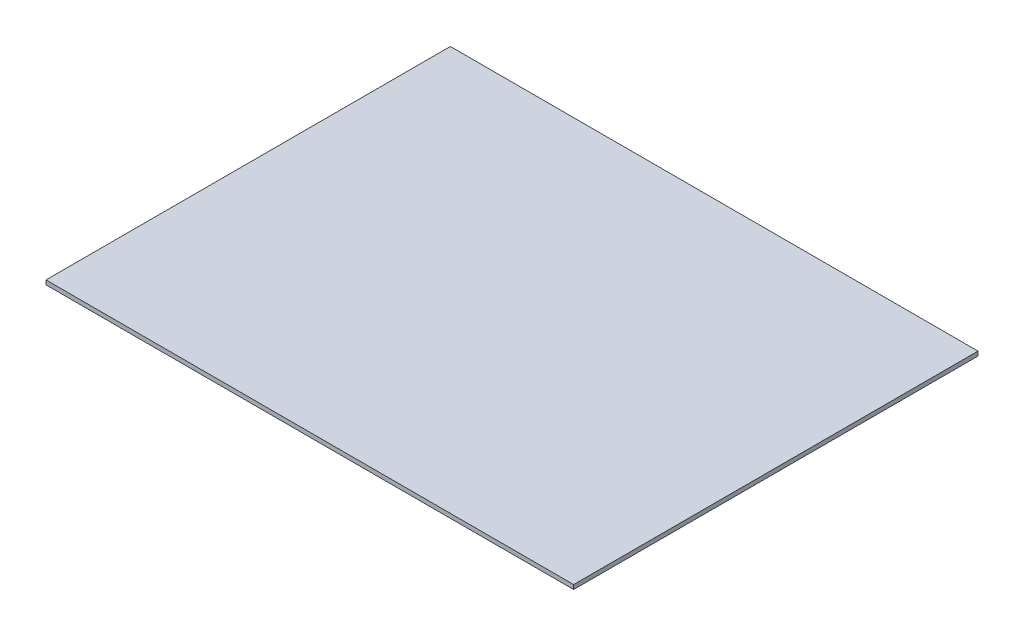
ISO-10303-21;
HEADER;
FILE_DESCRIPTION(('STEP AP214'),'2;1');
FILE_NAME('part.step','',(''),(''),'','','');
FILE_SCHEMA(('AUTOMOTIVE_DESIGN { 1 0 10303 214 1 1 1 1 }'));
ENDSEC;
DATA;
#1=APPLICATION_CONTEXT('core data for automotive mechanical design processes');
#2=APPLICATION_PROTOCOL_DEFINITION('international standard','automotive_design',2000,#1);
#3=PRODUCT_CONTEXT('',#1,'mechanical');
#4=PRODUCT('Part','Part','',(#3));
#5=PRODUCT_RELATED_PRODUCT_CATEGORY('part','',(#4));
#6=PRODUCT_DEFINITION_FORMATION('','',#4);
#7=PRODUCT_DEFINITION_CONTEXT('part definition',#1,'design');
#8=PRODUCT_DEFINITION('design','',#6,#7);
#9=PRODUCT_DEFINITION_SHAPE('','',#8);
#10=(LENGTH_UNIT() NAMED_UNIT(*) SI_UNIT(.MILLI.,.METRE.));
#11=(NAMED_UNIT(*) PLANE_ANGLE_UNIT() SI_UNIT($,.RADIAN.));
#12=(NAMED_UNIT(*) SI_UNIT($,.STERADIAN.) SOLID_ANGLE_UNIT());
#13=UNCERTAINTY_MEASURE_WITH_UNIT(LENGTH_MEASURE(1.E-05),#10,'distance_accuracy_value','');
#14=(GEOMETRIC_REPRESENTATION_CONTEXT(3) GLOBAL_UNCERTAINTY_ASSIGNED_CONTEXT((#13)) GLOBAL_UNIT_ASSIGNED_CONTEXT((#10,
#11,#12)) REPRESENTATION_CONTEXT('',''));
#15=CARTESIAN_POINT('',(0.,0.,0.));
#16=DIRECTION('',(0.,0.,1.));
#17=DIRECTION('',(1.,0.,0.));
#18=AXIS2_PLACEMENT_3D('',#15,#16,#17);
#19=CARTESIAN_POINT('',(92.,1.5,70.5));
#20=DIRECTION('',(-1.,0.,0.));
#21=DIRECTION('',(0.,0.,1.));
#22=AXIS2_PLACEMENT_3D('',#19,#20,#21);
#23=PLANE('',#22);
#24=DIRECTION('',(0.,0.,-1.));
#25=VECTOR('',#24,1.);
#26=CARTESIAN_POINT('',(92.,0.,70.5));
#27=LINE('',#26,#25);
#28=CARTESIAN_POINT('',(92.,0.,70.5));
#29=VERTEX_POINT('',#28);
#30=CARTESIAN_POINT('',(92.,0.,-70.5));
#31=VERTEX_POINT('',#30);
#32=EDGE_CURVE('E113',#29,#31,#27,.T.);
#33=ORIENTED_EDGE('',*,*,#32,.T.);
#34=DIRECTION('',(0.,-1.,0.));
#35=VECTOR('',#34,1.);
#36=CARTESIAN_POINT('',(92.,1.5,-70.5));
#37=LINE('',#36,#35);
#38=CARTESIAN_POINT('',(92.,1.5,-70.5));
#39=VERTEX_POINT('',#38);
#40=EDGE_CURVE('E11',#39,#31,#37,.T.);
#41=ORIENTED_EDGE('',*,*,#40,.F.);
#42=DIRECTION('',(0.,0.,-1.));
#43=VECTOR('',#42,1.);
#44=CARTESIAN_POINT('',(92.,1.5,70.5));
#45=LINE('',#44,#43);
#46=CARTESIAN_POINT('',(92.,1.5,70.5));
#47=VERTEX_POINT('',#46);
#48=EDGE_CURVE('E97',#47,#39,#45,.T.);
#49=ORIENTED_EDGE('',*,*,#48,.F.);
#50=DIRECTION('',(0.,-1.,0.));
#51=VECTOR('',#50,1.);
#52=CARTESIAN_POINT('',(92.,1.5,70.5));
#53=LINE('',#52,#51);
#54=EDGE_CURVE('E109',#47,#29,#53,.T.);
#55=ORIENTED_EDGE('',*,*,#54,.T.);
#56=EDGE_LOOP('',(#33,#41,#49,#55));
#57=FACE_BOUND('',#56,.T.);
#58=ADVANCED_FACE('F45',(#57),#23,.F.);
#59=CARTESIAN_POINT('',(-92.,1.5,-70.5));
#60=DIRECTION('',(0.,0.,1.));
#61=DIRECTION('',(1.,0.,0.));
#62=AXIS2_PLACEMENT_3D('',#59,#60,#61);
#63=PLANE('',#62);
#64=DIRECTION('',(-1.,0.,0.));
#65=VECTOR('',#64,1.);
#66=CARTESIAN_POINT('',(-92.,0.,-70.5));
#67=LINE('',#66,#65);
#68=CARTESIAN_POINT('',(-92.,0.,-70.5));
#69=VERTEX_POINT('',#68);
#70=EDGE_CURVE('E102',#31,#69,#67,.T.);
#71=ORIENTED_EDGE('',*,*,#70,.T.);
#72=DIRECTION('',(0.,-1.,0.));
#73=VECTOR('',#72,1.);
#74=CARTESIAN_POINT('',(-92.,1.5,-70.5));
#75=LINE('',#74,#73);
#76=CARTESIAN_POINT('',(-92.,1.5,-70.5));
#77=VERTEX_POINT('',#76);
#78=EDGE_CURVE('E54',#77,#69,#75,.T.);
#79=ORIENTED_EDGE('',*,*,#78,.F.);
#80=DIRECTION('',(-1.,0.,0.));
#81=VECTOR('',#80,1.);
#82=CARTESIAN_POINT('',(-92.,1.5,-70.5));
#83=LINE('',#82,#81);
#84=EDGE_CURVE('E92',#39,#77,#83,.T.);
#85=ORIENTED_EDGE('',*,*,#84,.F.);
#86=ORIENTED_EDGE('',*,*,#40,.T.);
#87=EDGE_LOOP('',(#71,#79,#85,#86));
#88=FACE_BOUND('',#87,.T.);
#89=ADVANCED_FACE('F101',(#88),#63,.F.);
#90=CARTESIAN_POINT('',(-92.,1.5,70.5));
#91=DIRECTION('',(1.,0.,0.));
#92=DIRECTION('',(0.,0.,-1.));
#93=AXIS2_PLACEMENT_3D('',#90,#91,#92);
#94=PLANE('',#93);
#95=DIRECTION('',(0.,0.,1.));
#96=VECTOR('',#95,1.);
#97=CARTESIAN_POINT('',(-92.,0.,70.5));
#98=LINE('',#97,#96);
#99=CARTESIAN_POINT('',(-92.,0.,70.5));
#100=VERTEX_POINT('',#99);
#101=EDGE_CURVE('E79',#69,#100,#98,.T.);
#102=ORIENTED_EDGE('',*,*,#101,.T.);
#103=DIRECTION('',(0.,-1.,0.));
#104=VECTOR('',#103,1.);
#105=CARTESIAN_POINT('',(-92.,1.5,70.5));
#106=LINE('',#105,#104);
#107=CARTESIAN_POINT('',(-92.,1.5,70.5));
#108=VERTEX_POINT('',#107);
#109=EDGE_CURVE('E104',#108,#100,#106,.T.);
#110=ORIENTED_EDGE('',*,*,#109,.F.);
#111=DIRECTION('',(0.,0.,1.));
#112=VECTOR('',#111,1.);
#113=CARTESIAN_POINT('',(-92.,1.5,70.5));
#114=LINE('',#113,#112);
#115=EDGE_CURVE('E95',#77,#108,#114,.T.);
#116=ORIENTED_EDGE('',*,*,#115,.F.);
#117=ORIENTED_EDGE('',*,*,#78,.T.);
#118=EDGE_LOOP('',(#102,#110,#116,#117));
#119=FACE_BOUND('',#118,.T.);
#120=ADVANCED_FACE('F105',(#119),#94,.F.);
#121=CARTESIAN_POINT('',(-92.,1.5,70.5));
#122=DIRECTION('',(0.,0.,-1.));
#123=DIRECTION('',(-1.,0.,0.));
#124=AXIS2_PLACEMENT_3D('',#121,#122,#123);
#125=PLANE('',#124);
#126=DIRECTION('',(1.,0.,0.));
#127=VECTOR('',#126,1.);
#128=CARTESIAN_POINT('',(-92.,0.,70.5));
#129=LINE('',#128,#127);
#130=EDGE_CURVE('E85',#100,#29,#129,.T.);
#131=ORIENTED_EDGE('',*,*,#130,.T.);
#132=ORIENTED_EDGE('',*,*,#54,.F.);
#133=DIRECTION('',(1.,0.,0.));
#134=VECTOR('',#133,1.);
#135=CARTESIAN_POINT('',(-92.,1.5,70.5));
#136=LINE('',#135,#134);
#137=EDGE_CURVE('E62',#108,#47,#136,.T.);
#138=ORIENTED_EDGE('',*,*,#137,.F.);
#139=ORIENTED_EDGE('',*,*,#109,.T.);
#140=EDGE_LOOP('',(#131,#132,#138,#139));
#141=FACE_BOUND('',#140,.T.);
#142=ADVANCED_FACE('F126',(#141),#125,.F.);
#143=CARTESIAN_POINT('',(0.,1.5,0.));
#144=DIRECTION('',(0.,-1.,0.));
#145=DIRECTION('',(0.,0.,-1.));
#146=AXIS2_PLACEMENT_3D('',#143,#144,#145);
#147=PLANE('',#146);
#148=ORIENTED_EDGE('',*,*,#48,.T.);
#149=ORIENTED_EDGE('',*,*,#84,.T.);
#150=ORIENTED_EDGE('',*,*,#115,.T.);
#151=ORIENTED_EDGE('',*,*,#137,.T.);
#152=EDGE_LOOP('',(#148,#149,#150,#151));
#153=FACE_BOUND('',#152,.T.);
#154=ADVANCED_FACE('F93',(#153),#147,.F.);
#155=CARTESIAN_POINT('',(0.,0.,0.));
#156=DIRECTION('',(0.,-1.,0.));
#157=DIRECTION('',(0.,0.,-1.));
#158=AXIS2_PLACEMENT_3D('',#155,#156,#157);
#159=PLANE('',#158);
#160=ORIENTED_EDGE('',*,*,#32,.F.);
#161=ORIENTED_EDGE('',*,*,#130,.F.);
#162=ORIENTED_EDGE('',*,*,#101,.F.);
#163=ORIENTED_EDGE('',*,*,#70,.F.);
#164=EDGE_LOOP('',(#160,#161,#162,#163));
#165=FACE_BOUND('',#164,.T.);
#166=ADVANCED_FACE('F129',(#165),#159,.T.);
#167=CLOSED_SHELL('',(#58,#89,#120,#142,#154,#166));
#168=MANIFOLD_SOLID_BREP('B2',#167);
#169=ADVANCED_BREP_SHAPE_REPRESENTATION('',(#18,#168),#14);
#170=SHAPE_DEFINITION_REPRESENTATION(#9,#169);
ENDSEC;
END-ISO-10303-21;
